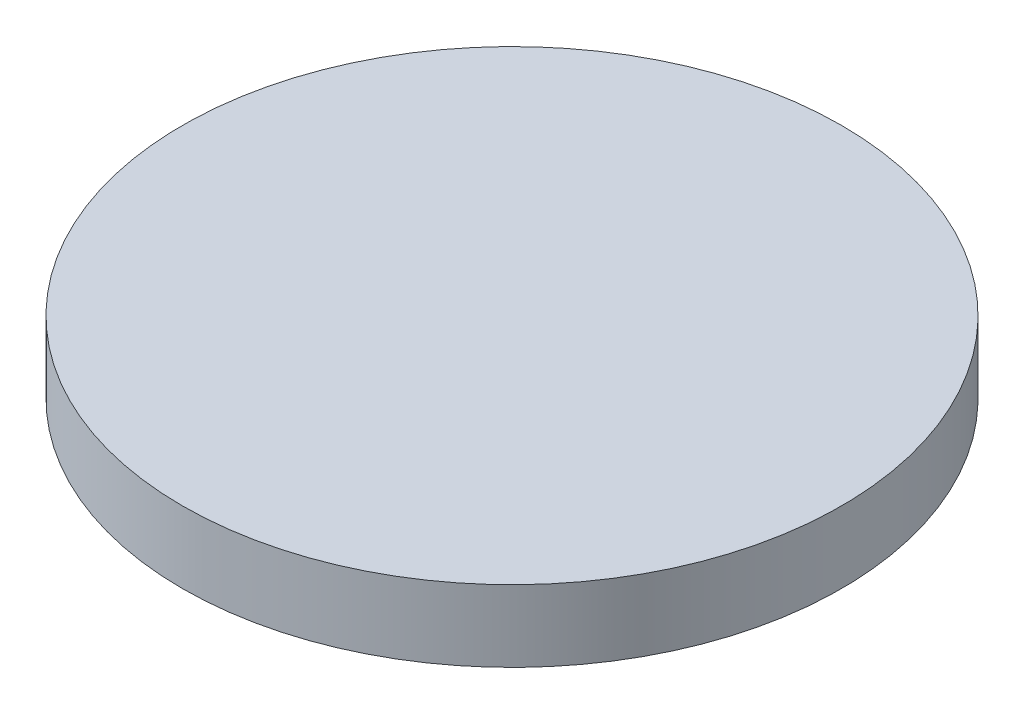
ISO-10303-21;
HEADER;
FILE_DESCRIPTION(('STEP AP214'),'2;1');
FILE_NAME('part.step','',(''),(''),'','','');
FILE_SCHEMA(('AUTOMOTIVE_DESIGN { 1 0 10303 214 1 1 1 1 }'));
ENDSEC;
DATA;
#1=APPLICATION_CONTEXT('core data for automotive mechanical design processes');
#2=APPLICATION_PROTOCOL_DEFINITION('international standard','automotive_design',2000,#1);
#3=PRODUCT_CONTEXT('',#1,'mechanical');
#4=PRODUCT('Part','Part','',(#3));
#5=PRODUCT_RELATED_PRODUCT_CATEGORY('part','',(#4));
#6=PRODUCT_DEFINITION_FORMATION('','',#4);
#7=PRODUCT_DEFINITION_CONTEXT('part definition',#1,'design');
#8=PRODUCT_DEFINITION('design','',#6,#7);
#9=PRODUCT_DEFINITION_SHAPE('','',#8);
#10=(LENGTH_UNIT() NAMED_UNIT(*) SI_UNIT(.MILLI.,.METRE.));
#11=(NAMED_UNIT(*) PLANE_ANGLE_UNIT() SI_UNIT($,.RADIAN.));
#12=(NAMED_UNIT(*) SI_UNIT($,.STERADIAN.) SOLID_ANGLE_UNIT());
#13=UNCERTAINTY_MEASURE_WITH_UNIT(LENGTH_MEASURE(1.E-05),#10,'distance_accuracy_value','');
#14=(GEOMETRIC_REPRESENTATION_CONTEXT(3) GLOBAL_UNCERTAINTY_ASSIGNED_CONTEXT((#13)) GLOBAL_UNIT_ASSIGNED_CONTEXT((#10,
#11,#12)) REPRESENTATION_CONTEXT('',''));
#15=CARTESIAN_POINT('',(0.,0.,0.));
#16=DIRECTION('',(0.,0.,1.));
#17=DIRECTION('',(1.,0.,0.));
#18=AXIS2_PLACEMENT_3D('',#15,#16,#17);
#19=CARTESIAN_POINT('',(0.,1.,0.));
#20=DIRECTION('',(0.,-1.,0.));
#21=DIRECTION('',(0.,0.,-1.));
#22=AXIS2_PLACEMENT_3D('',#19,#20,#21);
#23=CYLINDRICAL_SURFACE('',#22,4.6);
#24=CARTESIAN_POINT('',(0.,1.,0.));
#25=DIRECTION('',(0.,1.,0.));
#26=DIRECTION('',(0.,0.,1.));
#27=AXIS2_PLACEMENT_3D('',#24,#25,#26);
#28=CIRCLE('',#27,4.6);
#29=CARTESIAN_POINT('',(0.,1.,4.6));
#30=VERTEX_POINT('',#29);
#31=EDGE_CURVE('E10',#30,#30,#28,.T.);
#32=ORIENTED_EDGE('',*,*,#31,.F.);
#33=EDGE_LOOP('',(#32));
#34=FACE_BOUND('',#33,.T.);
#35=CARTESIAN_POINT('',(0.,0.,0.));
#36=DIRECTION('',(0.,1.,0.));
#37=DIRECTION('',(0.,0.,1.));
#38=AXIS2_PLACEMENT_3D('',#35,#36,#37);
#39=CIRCLE('',#38,4.6);
#40=CARTESIAN_POINT('',(0.,0.,4.6));
#41=VERTEX_POINT('',#40);
#42=EDGE_CURVE('E38',#41,#41,#39,.T.);
#43=ORIENTED_EDGE('',*,*,#42,.T.);
#44=EDGE_LOOP('',(#43));
#45=FACE_BOUND('',#44,.T.);
#46=ADVANCED_FACE('F35',(#34,#45),#23,.T.);
#47=CARTESIAN_POINT('',(0.,1.,0.));
#48=DIRECTION('',(0.,1.,0.));
#49=DIRECTION('',(0.,0.,1.));
#50=AXIS2_PLACEMENT_3D('',#47,#48,#49);
#51=PLANE('',#50);
#52=ORIENTED_EDGE('',*,*,#31,.T.);
#53=EDGE_LOOP('',(#52));
#54=FACE_BOUND('',#53,.T.);
#55=ADVANCED_FACE('F50',(#54),#51,.T.);
#56=CARTESIAN_POINT('',(0.,0.,0.));
#57=DIRECTION('',(0.,1.,0.));
#58=DIRECTION('',(0.,0.,1.));
#59=AXIS2_PLACEMENT_3D('',#56,#57,#58);
#60=PLANE('',#59);
#61=ORIENTED_EDGE('',*,*,#42,.F.);
#62=EDGE_LOOP('',(#61));
#63=FACE_BOUND('',#62,.T.);
#64=ADVANCED_FACE('F48',(#63),#60,.F.);
#65=CLOSED_SHELL('',(#46,#55,#64));
#66=MANIFOLD_SOLID_BREP('B2',#65);
#67=ADVANCED_BREP_SHAPE_REPRESENTATION('',(#18,#66),#14);
#68=SHAPE_DEFINITION_REPRESENTATION(#9,#67);
ENDSEC;
END-ISO-10303-21;
